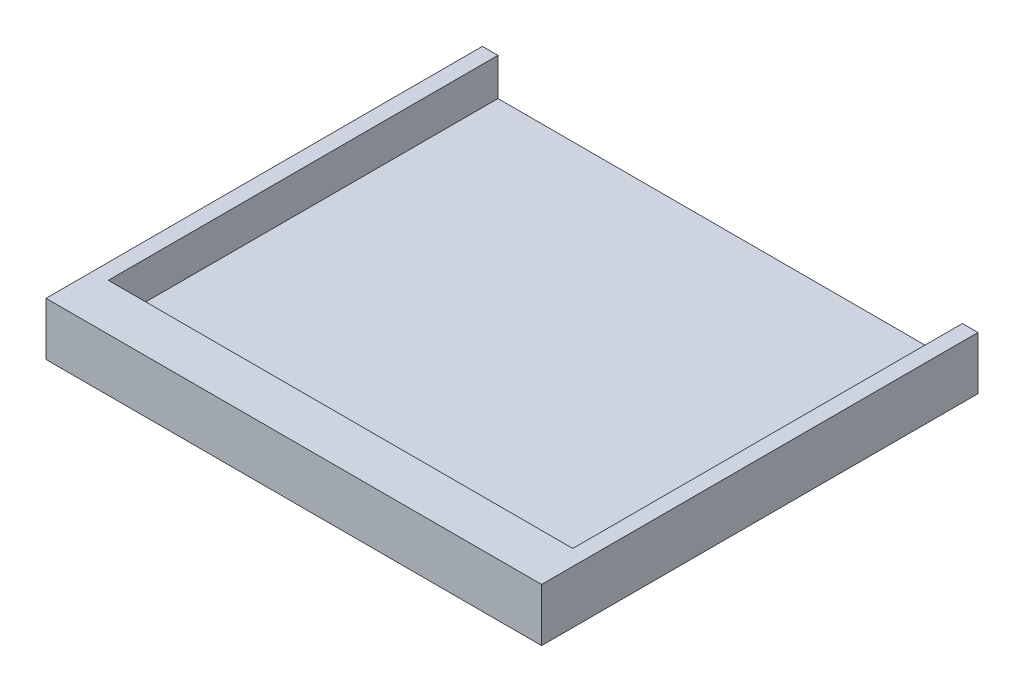
ISO-10303-21;
HEADER;
FILE_DESCRIPTION(('STEP AP214'),'2;1');
FILE_NAME('part.step','',(''),(''),'','','');
FILE_SCHEMA(('AUTOMOTIVE_DESIGN { 1 0 10303 214 1 1 1 1 }'));
ENDSEC;
DATA;
#1=APPLICATION_CONTEXT('core data for automotive mechanical design processes');
#2=APPLICATION_PROTOCOL_DEFINITION('international standard','automotive_design',2000,#1);
#3=PRODUCT_CONTEXT('',#1,'mechanical');
#4=PRODUCT('Part','Part','',(#3));
#5=PRODUCT_RELATED_PRODUCT_CATEGORY('part','',(#4));
#6=PRODUCT_DEFINITION_FORMATION('','',#4);
#7=PRODUCT_DEFINITION_CONTEXT('part definition',#1,'design');
#8=PRODUCT_DEFINITION('design','',#6,#7);
#9=PRODUCT_DEFINITION_SHAPE('','',#8);
#10=(LENGTH_UNIT() NAMED_UNIT(*) SI_UNIT(.MILLI.,.METRE.));
#11=(NAMED_UNIT(*) PLANE_ANGLE_UNIT() SI_UNIT($,.RADIAN.));
#12=(NAMED_UNIT(*) SI_UNIT($,.STERADIAN.) SOLID_ANGLE_UNIT());
#13=UNCERTAINTY_MEASURE_WITH_UNIT(LENGTH_MEASURE(1.E-05),#10,'distance_accuracy_value','');
#14=(GEOMETRIC_REPRESENTATION_CONTEXT(3) GLOBAL_UNCERTAINTY_ASSIGNED_CONTEXT((#13)) GLOBAL_UNIT_ASSIGNED_CONTEXT((#10,
#11,#12)) REPRESENTATION_CONTEXT('',''));
#15=CARTESIAN_POINT('',(0.,0.,0.));
#16=DIRECTION('',(0.,0.,1.));
#17=DIRECTION('',(1.,0.,0.));
#18=AXIS2_PLACEMENT_3D('',#15,#16,#17);
#19=CARTESIAN_POINT('',(15.9,3.4,11.5));
#20=DIRECTION('',(0.,0.,1.));
#21=DIRECTION('',(1.,0.,0.));
#22=AXIS2_PLACEMENT_3D('',#19,#20,#21);
#23=PLANE('',#22);
#24=DIRECTION('',(0.,-1.,0.));
#25=VECTOR('',#24,1.);
#26=CARTESIAN_POINT('',(-14.9,3.4,11.5));
#27=LINE('',#26,#25);
#28=CARTESIAN_POINT('',(-14.9,3.4,11.5));
#29=VERTEX_POINT('',#28);
#30=CARTESIAN_POINT('',(-14.9,2.4,11.5));
#31=VERTEX_POINT('',#30);
#32=EDGE_CURVE('E117',#29,#31,#27,.T.);
#33=ORIENTED_EDGE('',*,*,#32,.F.);
#34=DIRECTION('',(-1.,0.,0.));
#35=VECTOR('',#34,1.);
#36=CARTESIAN_POINT('',(15.9,3.4,11.5));
#37=LINE('',#36,#35);
#38=CARTESIAN_POINT('',(14.9,3.4,11.5));
#39=VERTEX_POINT('',#38);
#40=EDGE_CURVE('E131',#39,#29,#37,.T.);
#41=ORIENTED_EDGE('',*,*,#40,.F.);
#42=DIRECTION('',(0.,-1.,0.));
#43=VECTOR('',#42,1.);
#44=CARTESIAN_POINT('',(14.9,3.4,11.5));
#45=LINE('',#44,#43);
#46=CARTESIAN_POINT('',(14.9,2.4,11.5));
#47=VERTEX_POINT('',#46);
#48=EDGE_CURVE('E51',#39,#47,#45,.T.);
#49=ORIENTED_EDGE('',*,*,#48,.T.);
#50=DIRECTION('',(-1.,0.,0.));
#51=VECTOR('',#50,1.);
#52=CARTESIAN_POINT('',(15.9,2.4,11.5));
#53=LINE('',#52,#51);
#54=EDGE_CURVE('E133',#47,#31,#53,.T.);
#55=ORIENTED_EDGE('',*,*,#54,.T.);
#56=EDGE_LOOP('',(#33,#41,#49,#55));
#57=FACE_BOUND('',#56,.T.);
#58=ADVANCED_FACE('F35',(#57),#23,.F.);
#59=CARTESIAN_POINT('',(-14.9,1.,-13.5));
#60=DIRECTION('',(0.,0.,1.));
#61=DIRECTION('',(1.,0.,0.));
#62=AXIS2_PLACEMENT_3D('',#59,#60,#61);
#63=PLANE('',#62);
#64=DIRECTION('',(-1.,0.,0.));
#65=VECTOR('',#64,1.);
#66=CARTESIAN_POINT('',(-14.9,0.,-13.5));
#67=LINE('',#66,#65);
#68=CARTESIAN_POINT('',(15.9,0.,-13.5));
#69=VERTEX_POINT('',#68);
#70=CARTESIAN_POINT('',(-15.9,0.,-13.5));
#71=VERTEX_POINT('',#70);
#72=EDGE_CURVE('E39',#69,#71,#67,.T.);
#73=ORIENTED_EDGE('',*,*,#72,.T.);
#74=DIRECTION('',(0.,-1.,0.));
#75=VECTOR('',#74,1.);
#76=CARTESIAN_POINT('',(-15.9,2.4,-13.5));
#77=LINE('',#76,#75);
#78=CARTESIAN_POINT('',(-15.9,3.4,-13.5));
#79=VERTEX_POINT('',#78);
#80=EDGE_CURVE('E168',#79,#71,#77,.T.);
#81=ORIENTED_EDGE('',*,*,#80,.F.);
#82=DIRECTION('',(-1.,0.,0.));
#83=VECTOR('',#82,1.);
#84=CARTESIAN_POINT('',(-14.9,3.4,-13.5));
#85=LINE('',#84,#83);
#86=CARTESIAN_POINT('',(-14.9,3.4,-13.5));
#87=VERTEX_POINT('',#86);
#88=EDGE_CURVE('E126',#87,#79,#85,.T.);
#89=ORIENTED_EDGE('',*,*,#88,.F.);
#90=DIRECTION('',(0.,-1.,0.));
#91=VECTOR('',#90,1.);
#92=CARTESIAN_POINT('',(-14.9,2.4,-13.5));
#93=LINE('',#92,#91);
#94=CARTESIAN_POINT('',(-14.9,1.,-13.5));
#95=VERTEX_POINT('',#94);
#96=EDGE_CURVE('E121',#87,#95,#93,.T.);
#97=ORIENTED_EDGE('',*,*,#96,.T.);
#98=DIRECTION('',(-1.,0.,0.));
#99=VECTOR('',#98,1.);
#100=CARTESIAN_POINT('',(-14.9,1.,-13.5));
#101=LINE('',#100,#99);
#102=CARTESIAN_POINT('',(14.9,1.,-13.5));
#103=VERTEX_POINT('',#102);
#104=EDGE_CURVE('E189',#103,#95,#101,.T.);
#105=ORIENTED_EDGE('',*,*,#104,.F.);
#106=DIRECTION('',(0.,-1.,0.));
#107=VECTOR('',#106,1.);
#108=CARTESIAN_POINT('',(14.9,2.4,-13.5));
#109=LINE('',#108,#107);
#110=CARTESIAN_POINT('',(14.9,3.4,-13.5));
#111=VERTEX_POINT('',#110);
#112=EDGE_CURVE('E178',#111,#103,#109,.T.);
#113=ORIENTED_EDGE('',*,*,#112,.F.);
#114=DIRECTION('',(-1.,0.,0.));
#115=VECTOR('',#114,1.);
#116=CARTESIAN_POINT('',(15.9,3.4,-13.5));
#117=LINE('',#116,#115);
#118=CARTESIAN_POINT('',(15.9,3.4,-13.5));
#119=VERTEX_POINT('',#118);
#120=EDGE_CURVE('E200',#119,#111,#117,.T.);
#121=ORIENTED_EDGE('',*,*,#120,.F.);
#122=DIRECTION('',(0.,-1.,0.));
#123=VECTOR('',#122,1.);
#124=CARTESIAN_POINT('',(15.9,2.4,-13.5));
#125=LINE('',#124,#123);
#126=EDGE_CURVE('E175',#119,#69,#125,.T.);
#127=ORIENTED_EDGE('',*,*,#126,.T.);
#128=EDGE_LOOP('',(#73,#81,#89,#97,#105,#113,#121,#127));
#129=FACE_BOUND('',#128,.T.);
#130=ADVANCED_FACE('F37',(#129),#63,.F.);
#131=CARTESIAN_POINT('',(0.,1.,0.));
#132=DIRECTION('',(0.,-1.,0.));
#133=DIRECTION('',(0.,0.,-1.));
#134=AXIS2_PLACEMENT_3D('',#131,#132,#133);
#135=PLANE('',#134);
#136=DIRECTION('',(0.,0.,-1.));
#137=VECTOR('',#136,1.);
#138=CARTESIAN_POINT('',(14.9,1.,13.5));
#139=LINE('',#138,#137);
#140=CARTESIAN_POINT('',(14.9,1.,13.5));
#141=VERTEX_POINT('',#140);
#142=EDGE_CURVE('E187',#141,#103,#139,.T.);
#143=ORIENTED_EDGE('',*,*,#142,.T.);
#144=ORIENTED_EDGE('',*,*,#104,.T.);
#145=DIRECTION('',(0.,0.,1.));
#146=VECTOR('',#145,1.);
#147=CARTESIAN_POINT('',(-14.9,1.,13.5));
#148=LINE('',#147,#146);
#149=CARTESIAN_POINT('',(-14.9,1.,13.5));
#150=VERTEX_POINT('',#149);
#151=EDGE_CURVE('E44',#95,#150,#148,.T.);
#152=ORIENTED_EDGE('',*,*,#151,.T.);
#153=DIRECTION('',(1.,0.,0.));
#154=VECTOR('',#153,1.);
#155=CARTESIAN_POINT('',(-14.9,1.,13.5));
#156=LINE('',#155,#154);
#157=EDGE_CURVE('E11',#150,#141,#156,.T.);
#158=ORIENTED_EDGE('',*,*,#157,.T.);
#159=EDGE_LOOP('',(#143,#144,#152,#158));
#160=FACE_BOUND('',#159,.T.);
#161=ADVANCED_FACE('F191',(#160),#135,.F.);
#162=CARTESIAN_POINT('',(0.,0.,0.));
#163=DIRECTION('',(0.,-1.,0.));
#164=DIRECTION('',(0.,0.,-1.));
#165=AXIS2_PLACEMENT_3D('',#162,#163,#164);
#166=PLANE('',#165);
#167=ORIENTED_EDGE('',*,*,#72,.F.);
#168=DIRECTION('',(0.,0.,1.));
#169=VECTOR('',#168,1.);
#170=CARTESIAN_POINT('',(15.9,0.,0.));
#171=LINE('',#170,#169);
#172=CARTESIAN_POINT('',(15.9,0.,14.5));
#173=VERTEX_POINT('',#172);
#174=EDGE_CURVE('E150',#69,#173,#171,.T.);
#175=ORIENTED_EDGE('',*,*,#174,.T.);
#176=DIRECTION('',(-1.,0.,0.));
#177=VECTOR('',#176,1.);
#178=CARTESIAN_POINT('',(0.,0.,14.5));
#179=LINE('',#178,#177);
#180=CARTESIAN_POINT('',(-15.9,0.,14.5));
#181=VERTEX_POINT('',#180);
#182=EDGE_CURVE('E163',#173,#181,#179,.T.);
#183=ORIENTED_EDGE('',*,*,#182,.T.);
#184=DIRECTION('',(0.,0.,-1.));
#185=VECTOR('',#184,1.);
#186=CARTESIAN_POINT('',(-15.9,0.,0.));
#187=LINE('',#186,#185);
#188=EDGE_CURVE('E155',#181,#71,#187,.T.);
#189=ORIENTED_EDGE('',*,*,#188,.T.);
#190=EDGE_LOOP('',(#167,#175,#183,#189));
#191=FACE_BOUND('',#190,.T.);
#192=ADVANCED_FACE('F214',(#191),#166,.T.);
#193=CARTESIAN_POINT('',(14.9,2.4,0.));
#194=DIRECTION('',(1.,0.,0.));
#195=DIRECTION('',(0.,0.,-1.));
#196=AXIS2_PLACEMENT_3D('',#193,#194,#195);
#197=PLANE('',#196);
#198=ORIENTED_EDGE('',*,*,#112,.T.);
#199=ORIENTED_EDGE('',*,*,#142,.F.);
#200=DIRECTION('',(0.,-1.,0.));
#201=VECTOR('',#200,1.);
#202=CARTESIAN_POINT('',(14.9,2.4,13.5));
#203=LINE('',#202,#201);
#204=CARTESIAN_POINT('',(14.9,2.4,13.5));
#205=VERTEX_POINT('',#204);
#206=EDGE_CURVE('E181',#205,#141,#203,.T.);
#207=ORIENTED_EDGE('',*,*,#206,.F.);
#208=DIRECTION('',(0.,0.,1.));
#209=VECTOR('',#208,1.);
#210=CARTESIAN_POINT('',(14.9,2.4,0.));
#211=LINE('',#210,#209);
#212=EDGE_CURVE('E158',#47,#205,#211,.T.);
#213=ORIENTED_EDGE('',*,*,#212,.F.);
#214=ORIENTED_EDGE('',*,*,#48,.F.);
#215=DIRECTION('',(0.,0.,1.));
#216=VECTOR('',#215,1.);
#217=CARTESIAN_POINT('',(14.9,3.4,-13.5));
#218=LINE('',#217,#216);
#219=EDGE_CURVE('E134',#111,#39,#218,.T.);
#220=ORIENTED_EDGE('',*,*,#219,.F.);
#221=EDGE_LOOP('',(#198,#199,#207,#213,#214,#220));
#222=FACE_BOUND('',#221,.T.);
#223=ADVANCED_FACE('F197',(#222),#197,.F.);
#224=CARTESIAN_POINT('',(0.,2.4,13.5));
#225=DIRECTION('',(0.,0.,1.));
#226=DIRECTION('',(1.,0.,0.));
#227=AXIS2_PLACEMENT_3D('',#224,#225,#226);
#228=PLANE('',#227);
#229=ORIENTED_EDGE('',*,*,#206,.T.);
#230=ORIENTED_EDGE('',*,*,#157,.F.);
#231=DIRECTION('',(0.,-1.,0.));
#232=VECTOR('',#231,1.);
#233=CARTESIAN_POINT('',(-14.9,2.4,13.5));
#234=LINE('',#233,#232);
#235=CARTESIAN_POINT('',(-14.9,2.4,13.5));
#236=VERTEX_POINT('',#235);
#237=EDGE_CURVE('E184',#236,#150,#234,.T.);
#238=ORIENTED_EDGE('',*,*,#237,.F.);
#239=DIRECTION('',(-1.,0.,0.));
#240=VECTOR('',#239,1.);
#241=CARTESIAN_POINT('',(0.,2.4,13.5));
#242=LINE('',#241,#240);
#243=EDGE_CURVE('E154',#205,#236,#242,.T.);
#244=ORIENTED_EDGE('',*,*,#243,.F.);
#245=EDGE_LOOP('',(#229,#230,#238,#244));
#246=FACE_BOUND('',#245,.T.);
#247=ADVANCED_FACE('F193',(#246),#228,.F.);
#248=CARTESIAN_POINT('',(-14.9,2.4,0.));
#249=DIRECTION('',(-1.,0.,0.));
#250=DIRECTION('',(0.,0.,1.));
#251=AXIS2_PLACEMENT_3D('',#248,#249,#250);
#252=PLANE('',#251);
#253=ORIENTED_EDGE('',*,*,#237,.T.);
#254=ORIENTED_EDGE('',*,*,#151,.F.);
#255=ORIENTED_EDGE('',*,*,#96,.F.);
#256=DIRECTION('',(0.,0.,-1.));
#257=VECTOR('',#256,1.);
#258=CARTESIAN_POINT('',(-14.9,3.4,11.5));
#259=LINE('',#258,#257);
#260=EDGE_CURVE('E112',#29,#87,#259,.T.);
#261=ORIENTED_EDGE('',*,*,#260,.F.);
#262=ORIENTED_EDGE('',*,*,#32,.T.);
#263=DIRECTION('',(0.,0.,-1.));
#264=VECTOR('',#263,1.);
#265=CARTESIAN_POINT('',(-14.9,2.4,0.));
#266=LINE('',#265,#264);
#267=EDGE_CURVE('E152',#236,#31,#266,.T.);
#268=ORIENTED_EDGE('',*,*,#267,.F.);
#269=EDGE_LOOP('',(#253,#254,#255,#261,#262,#268));
#270=FACE_BOUND('',#269,.T.);
#271=ADVANCED_FACE('F115',(#270),#252,.F.);
#272=CARTESIAN_POINT('',(-15.9,2.4,0.));
#273=DIRECTION('',(-1.,0.,0.));
#274=DIRECTION('',(0.,0.,1.));
#275=AXIS2_PLACEMENT_3D('',#272,#273,#274);
#276=PLANE('',#275);
#277=ORIENTED_EDGE('',*,*,#188,.F.);
#278=DIRECTION('',(0.,-1.,0.));
#279=VECTOR('',#278,1.);
#280=CARTESIAN_POINT('',(-15.9,2.4,14.5));
#281=LINE('',#280,#279);
#282=CARTESIAN_POINT('',(-15.9,3.4,14.5));
#283=VERTEX_POINT('',#282);
#284=EDGE_CURVE('E171',#283,#181,#281,.T.);
#285=ORIENTED_EDGE('',*,*,#284,.F.);
#286=DIRECTION('',(0.,0.,1.));
#287=VECTOR('',#286,1.);
#288=CARTESIAN_POINT('',(-15.9,3.4,14.5));
#289=LINE('',#288,#287);
#290=EDGE_CURVE('E139',#79,#283,#289,.T.);
#291=ORIENTED_EDGE('',*,*,#290,.F.);
#292=ORIENTED_EDGE('',*,*,#80,.T.);
#293=EDGE_LOOP('',(#277,#285,#291,#292));
#294=FACE_BOUND('',#293,.T.);
#295=ADVANCED_FACE('F209',(#294),#276,.T.);
#296=CARTESIAN_POINT('',(0.,2.4,14.5));
#297=DIRECTION('',(0.,0.,1.));
#298=DIRECTION('',(1.,0.,0.));
#299=AXIS2_PLACEMENT_3D('',#296,#297,#298);
#300=PLANE('',#299);
#301=ORIENTED_EDGE('',*,*,#182,.F.);
#302=DIRECTION('',(0.,-1.,0.));
#303=VECTOR('',#302,1.);
#304=CARTESIAN_POINT('',(15.9,2.4,14.5));
#305=LINE('',#304,#303);
#306=CARTESIAN_POINT('',(15.9,3.4,14.5));
#307=VERTEX_POINT('',#306);
#308=EDGE_CURVE('E173',#307,#173,#305,.T.);
#309=ORIENTED_EDGE('',*,*,#308,.F.);
#310=DIRECTION('',(1.,0.,0.));
#311=VECTOR('',#310,1.);
#312=CARTESIAN_POINT('',(15.9,3.4,14.5));
#313=LINE('',#312,#311);
#314=EDGE_CURVE('E143',#283,#307,#313,.T.);
#315=ORIENTED_EDGE('',*,*,#314,.F.);
#316=ORIENTED_EDGE('',*,*,#284,.T.);
#317=EDGE_LOOP('',(#301,#309,#315,#316));
#318=FACE_BOUND('',#317,.T.);
#319=ADVANCED_FACE('F212',(#318),#300,.T.);
#320=CARTESIAN_POINT('',(15.9,2.4,0.));
#321=DIRECTION('',(1.,0.,0.));
#322=DIRECTION('',(0.,0.,-1.));
#323=AXIS2_PLACEMENT_3D('',#320,#321,#322);
#324=PLANE('',#323);
#325=ORIENTED_EDGE('',*,*,#174,.F.);
#326=ORIENTED_EDGE('',*,*,#126,.F.);
#327=DIRECTION('',(0.,0.,-1.));
#328=VECTOR('',#327,1.);
#329=CARTESIAN_POINT('',(15.9,3.4,14.5));
#330=LINE('',#329,#328);
#331=EDGE_CURVE('E140',#307,#119,#330,.T.);
#332=ORIENTED_EDGE('',*,*,#331,.F.);
#333=ORIENTED_EDGE('',*,*,#308,.T.);
#334=EDGE_LOOP('',(#325,#326,#332,#333));
#335=FACE_BOUND('',#334,.T.);
#336=ADVANCED_FACE('F217',(#335),#324,.T.);
#337=CARTESIAN_POINT('',(0.,2.4,0.));
#338=DIRECTION('',(0.,1.,0.));
#339=DIRECTION('',(0.,0.,1.));
#340=AXIS2_PLACEMENT_3D('',#337,#338,#339);
#341=PLANE('',#340);
#342=ORIENTED_EDGE('',*,*,#54,.F.);
#343=ORIENTED_EDGE('',*,*,#212,.T.);
#344=ORIENTED_EDGE('',*,*,#243,.T.);
#345=ORIENTED_EDGE('',*,*,#267,.T.);
#346=EDGE_LOOP('',(#342,#343,#344,#345));
#347=FACE_BOUND('',#346,.T.);
#348=ADVANCED_FACE('F196',(#347),#341,.F.);
#349=CARTESIAN_POINT('',(0.,3.4,0.));
#350=DIRECTION('',(0.,1.,0.));
#351=DIRECTION('',(0.,0.,1.));
#352=AXIS2_PLACEMENT_3D('',#349,#350,#351);
#353=PLANE('',#352);
#354=ORIENTED_EDGE('',*,*,#331,.T.);
#355=ORIENTED_EDGE('',*,*,#120,.T.);
#356=ORIENTED_EDGE('',*,*,#219,.T.);
#357=ORIENTED_EDGE('',*,*,#40,.T.);
#358=ORIENTED_EDGE('',*,*,#260,.T.);
#359=ORIENTED_EDGE('',*,*,#88,.T.);
#360=ORIENTED_EDGE('',*,*,#290,.T.);
#361=ORIENTED_EDGE('',*,*,#314,.T.);
#362=EDGE_LOOP('',(#354,#355,#356,#357,#358,#359,#360,#361));
#363=FACE_BOUND('',#362,.T.);
#364=ADVANCED_FACE('F137',(#363),#353,.T.);
#365=CLOSED_SHELL('',(#58,#130,#161,#192,#223,#247,#271,#295,#319,#336,#348,#364));
#366=MANIFOLD_SOLID_BREP('B2',#365);
#367=ADVANCED_BREP_SHAPE_REPRESENTATION('',(#18,#366),#14);
#368=SHAPE_DEFINITION_REPRESENTATION(#9,#367);
ENDSEC;
END-ISO-10303-21;
